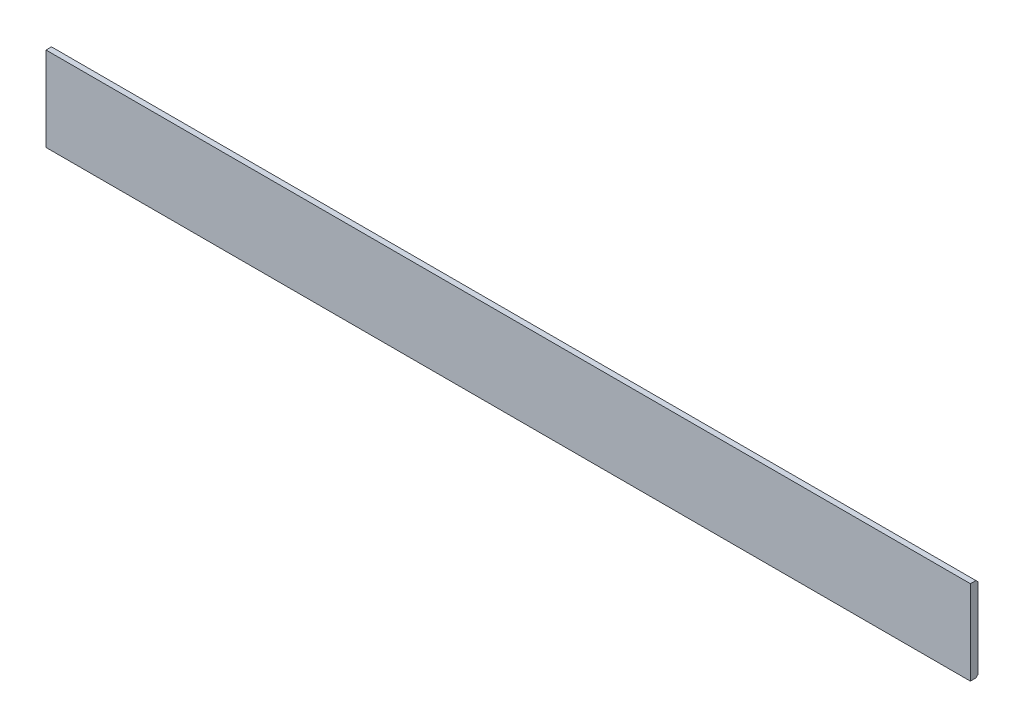
ISO-10303-21;
HEADER;
FILE_DESCRIPTION(('STEP AP214'),'2;1');
FILE_NAME('part.step','',(''),(''),'','','');
FILE_SCHEMA(('AUTOMOTIVE_DESIGN { 1 0 10303 214 1 1 1 1 }'));
ENDSEC;
DATA;
#1=APPLICATION_CONTEXT('core data for automotive mechanical design processes');
#2=APPLICATION_PROTOCOL_DEFINITION('international standard','automotive_design',2000,#1);
#3=PRODUCT_CONTEXT('',#1,'mechanical');
#4=PRODUCT('Part','Part','',(#3));
#5=PRODUCT_RELATED_PRODUCT_CATEGORY('part','',(#4));
#6=PRODUCT_DEFINITION_FORMATION('','',#4);
#7=PRODUCT_DEFINITION_CONTEXT('part definition',#1,'design');
#8=PRODUCT_DEFINITION('design','',#6,#7);
#9=PRODUCT_DEFINITION_SHAPE('','',#8);
#10=(LENGTH_UNIT() NAMED_UNIT(*) SI_UNIT(.MILLI.,.METRE.));
#11=(NAMED_UNIT(*) PLANE_ANGLE_UNIT() SI_UNIT($,.RADIAN.));
#12=(NAMED_UNIT(*) SI_UNIT($,.STERADIAN.) SOLID_ANGLE_UNIT());
#13=UNCERTAINTY_MEASURE_WITH_UNIT(LENGTH_MEASURE(1.E-05),#10,'distance_accuracy_value','');
#14=(GEOMETRIC_REPRESENTATION_CONTEXT(3) GLOBAL_UNCERTAINTY_ASSIGNED_CONTEXT((#13)) GLOBAL_UNIT_ASSIGNED_CONTEXT((#10,
#11,#12)) REPRESENTATION_CONTEXT('',''));
#15=CARTESIAN_POINT('',(0.,0.,0.));
#16=DIRECTION('',(0.,0.,1.));
#17=DIRECTION('',(1.,0.,0.));
#18=AXIS2_PLACEMENT_3D('',#15,#16,#17);
#19=CARTESIAN_POINT('',(1095.,100.,-18.));
#20=DIRECTION('',(1.,0.,0.));
#21=DIRECTION('',(0.,0.,-1.));
#22=AXIS2_PLACEMENT_3D('',#19,#20,#21);
#23=PLANE('',#22);
#24=DIRECTION('',(0.,0.,1.));
#25=VECTOR('',#24,1.);
#26=CARTESIAN_POINT('',(1095.,-100.,-18.));
#27=LINE('',#26,#25);
#28=CARTESIAN_POINT('',(1095.,-100.,-12.9999999999997));
#29=VERTEX_POINT('',#28);
#30=CARTESIAN_POINT('',(1095.,-100.,0.));
#31=VERTEX_POINT('',#30);
#32=EDGE_CURVE('E124',#29,#31,#27,.T.);
#33=ORIENTED_EDGE('',*,*,#32,.F.);
#34=DIRECTION('',(0.,0.707106781186532,-0.707106781186563));
#35=VECTOR('',#34,1.);
#36=CARTESIAN_POINT('',(1095.,2.49999999999573,-115.5));
#37=LINE('',#36,#35);
#38=CARTESIAN_POINT('',(1095.,-94.9999999999999,-18.));
#39=VERTEX_POINT('',#38);
#40=EDGE_CURVE('E133',#29,#39,#37,.T.);
#41=ORIENTED_EDGE('',*,*,#40,.T.);
#42=DIRECTION('',(0.,1.,0.));
#43=VECTOR('',#42,1.);
#44=CARTESIAN_POINT('',(1095.,100.,-18.));
#45=LINE('',#44,#43);
#46=CARTESIAN_POINT('',(1095.,94.9999999999999,-18.));
#47=VERTEX_POINT('',#46);
#48=EDGE_CURVE('E123',#39,#47,#45,.T.);
#49=ORIENTED_EDGE('',*,*,#48,.T.);
#50=DIRECTION('',(0.,0.707106781186532,0.707106781186563));
#51=VECTOR('',#50,1.);
#52=CARTESIAN_POINT('',(1095.,97.4999999999998,-15.4999999999999));
#53=LINE('',#52,#51);
#54=CARTESIAN_POINT('',(1095.,100.,-12.9999999999997));
#55=VERTEX_POINT('',#54);
#56=EDGE_CURVE('E100',#47,#55,#53,.T.);
#57=ORIENTED_EDGE('',*,*,#56,.T.);
#58=DIRECTION('',(0.,0.,1.));
#59=VECTOR('',#58,1.);
#60=CARTESIAN_POINT('',(1095.,100.,-18.));
#61=LINE('',#60,#59);
#62=CARTESIAN_POINT('',(1095.,100.,0.));
#63=VERTEX_POINT('',#62);
#64=EDGE_CURVE('E92',#55,#63,#61,.T.);
#65=ORIENTED_EDGE('',*,*,#64,.T.);
#66=DIRECTION('',(0.,1.,0.));
#67=VECTOR('',#66,1.);
#68=CARTESIAN_POINT('',(1095.,100.,0.));
#69=LINE('',#68,#67);
#70=EDGE_CURVE('E96',#31,#63,#69,.T.);
#71=ORIENTED_EDGE('',*,*,#70,.F.);
#72=EDGE_LOOP('',(#33,#41,#49,#57,#65,#71));
#73=FACE_BOUND('',#72,.T.);
#74=ADVANCED_FACE('F37',(#73),#23,.T.);
#75=CARTESIAN_POINT('',(-1095.,-100.,-18.));
#76=DIRECTION('',(0.,-1.,0.));
#77=DIRECTION('',(0.,0.,-1.));
#78=AXIS2_PLACEMENT_3D('',#75,#76,#77);
#79=PLANE('',#78);
#80=DIRECTION('',(0.,0.,1.));
#81=VECTOR('',#80,1.);
#82=CARTESIAN_POINT('',(-1095.,-100.,-18.));
#83=LINE('',#82,#81);
#84=CARTESIAN_POINT('',(-1095.,-100.,-12.9999999999997));
#85=VERTEX_POINT('',#84);
#86=CARTESIAN_POINT('',(-1095.,-100.,0.));
#87=VERTEX_POINT('',#86);
#88=EDGE_CURVE('E127',#85,#87,#83,.T.);
#89=ORIENTED_EDGE('',*,*,#88,.F.);
#90=DIRECTION('',(1.,0.,0.));
#91=VECTOR('',#90,1.);
#92=CARTESIAN_POINT('',(1095.,-100.,-12.9999999999997));
#93=LINE('',#92,#91);
#94=EDGE_CURVE('E126',#85,#29,#93,.T.);
#95=ORIENTED_EDGE('',*,*,#94,.T.);
#96=ORIENTED_EDGE('',*,*,#32,.T.);
#97=DIRECTION('',(1.,0.,0.));
#98=VECTOR('',#97,1.);
#99=CARTESIAN_POINT('',(-1095.,-100.,0.));
#100=LINE('',#99,#98);
#101=EDGE_CURVE('E116',#87,#31,#100,.T.);
#102=ORIENTED_EDGE('',*,*,#101,.F.);
#103=EDGE_LOOP('',(#89,#95,#96,#102));
#104=FACE_BOUND('',#103,.T.);
#105=ADVANCED_FACE('F145',(#104),#79,.T.);
#106=CARTESIAN_POINT('',(-1095.,100.,-18.));
#107=DIRECTION('',(-1.,0.,0.));
#108=DIRECTION('',(0.,0.,1.));
#109=AXIS2_PLACEMENT_3D('',#106,#107,#108);
#110=PLANE('',#109);
#111=DIRECTION('',(0.,-1.,0.));
#112=VECTOR('',#111,1.);
#113=CARTESIAN_POINT('',(-1095.,100.,-18.));
#114=LINE('',#113,#112);
#115=CARTESIAN_POINT('',(-1095.,94.9999999999999,-18.));
#116=VERTEX_POINT('',#115);
#117=CARTESIAN_POINT('',(-1095.,-94.9999999999999,-18.));
#118=VERTEX_POINT('',#117);
#119=EDGE_CURVE('E103',#116,#118,#114,.T.);
#120=ORIENTED_EDGE('',*,*,#119,.T.);
#121=DIRECTION('',(0.,-0.707106781186532,0.707106781186563));
#122=VECTOR('',#121,1.);
#123=CARTESIAN_POINT('',(-1095.,2.49999999999573,-115.5));
#124=LINE('',#123,#122);
#125=EDGE_CURVE('E45',#118,#85,#124,.T.);
#126=ORIENTED_EDGE('',*,*,#125,.T.);
#127=ORIENTED_EDGE('',*,*,#88,.T.);
#128=DIRECTION('',(0.,-1.,0.));
#129=VECTOR('',#128,1.);
#130=CARTESIAN_POINT('',(-1095.,100.,0.));
#131=LINE('',#130,#129);
#132=CARTESIAN_POINT('',(-1095.,100.,0.));
#133=VERTEX_POINT('',#132);
#134=EDGE_CURVE('E112',#133,#87,#131,.T.);
#135=ORIENTED_EDGE('',*,*,#134,.F.);
#136=DIRECTION('',(0.,0.,1.));
#137=VECTOR('',#136,1.);
#138=CARTESIAN_POINT('',(-1095.,100.,-18.));
#139=LINE('',#138,#137);
#140=CARTESIAN_POINT('',(-1095.,100.,-12.9999999999997));
#141=VERTEX_POINT('',#140);
#142=EDGE_CURVE('E102',#141,#133,#139,.T.);
#143=ORIENTED_EDGE('',*,*,#142,.F.);
#144=DIRECTION('',(0.,-0.707106781186532,-0.707106781186563));
#145=VECTOR('',#144,1.);
#146=CARTESIAN_POINT('',(-1095.,97.4999999999998,-15.4999999999999));
#147=LINE('',#146,#145);
#148=EDGE_CURVE('E52',#141,#116,#147,.T.);
#149=ORIENTED_EDGE('',*,*,#148,.T.);
#150=EDGE_LOOP('',(#120,#126,#127,#135,#143,#149));
#151=FACE_BOUND('',#150,.T.);
#152=ADVANCED_FACE('F141',(#151),#110,.T.);
#153=CARTESIAN_POINT('',(-1095.,100.,-18.));
#154=DIRECTION('',(0.,1.,0.));
#155=DIRECTION('',(0.,0.,1.));
#156=AXIS2_PLACEMENT_3D('',#153,#154,#155);
#157=PLANE('',#156);
#158=ORIENTED_EDGE('',*,*,#64,.F.);
#159=DIRECTION('',(-1.,0.,0.));
#160=VECTOR('',#159,1.);
#161=CARTESIAN_POINT('',(-1095.,100.,-12.9999999999997));
#162=LINE('',#161,#160);
#163=EDGE_CURVE('E11',#55,#141,#162,.T.);
#164=ORIENTED_EDGE('',*,*,#163,.T.);
#165=ORIENTED_EDGE('',*,*,#142,.T.);
#166=DIRECTION('',(-1.,0.,0.));
#167=VECTOR('',#166,1.);
#168=CARTESIAN_POINT('',(-1095.,100.,0.));
#169=LINE('',#168,#167);
#170=EDGE_CURVE('E106',#63,#133,#169,.T.);
#171=ORIENTED_EDGE('',*,*,#170,.F.);
#172=EDGE_LOOP('',(#158,#164,#165,#171));
#173=FACE_BOUND('',#172,.T.);
#174=ADVANCED_FACE('F107',(#173),#157,.T.);
#175=CARTESIAN_POINT('',(0.,0.,-18.));
#176=DIRECTION('',(0.,0.,1.));
#177=DIRECTION('',(1.,0.,0.));
#178=AXIS2_PLACEMENT_3D('',#175,#176,#177);
#179=PLANE('',#178);
#180=ORIENTED_EDGE('',*,*,#48,.F.);
#181=DIRECTION('',(-1.,0.,0.));
#182=VECTOR('',#181,1.);
#183=CARTESIAN_POINT('',(-1095.,-94.9999999999999,-18.));
#184=LINE('',#183,#182);
#185=EDGE_CURVE('E59',#39,#118,#184,.T.);
#186=ORIENTED_EDGE('',*,*,#185,.T.);
#187=ORIENTED_EDGE('',*,*,#119,.F.);
#188=DIRECTION('',(1.,0.,0.));
#189=VECTOR('',#188,1.);
#190=CARTESIAN_POINT('',(1095.,94.9999999999999,-18.));
#191=LINE('',#190,#189);
#192=EDGE_CURVE('E135',#116,#47,#191,.T.);
#193=ORIENTED_EDGE('',*,*,#192,.T.);
#194=EDGE_LOOP('',(#180,#186,#187,#193));
#195=FACE_BOUND('',#194,.T.);
#196=ADVANCED_FACE('F147',(#195),#179,.F.);
#197=CARTESIAN_POINT('',(0.,0.,0.));
#198=DIRECTION('',(0.,0.,1.));
#199=DIRECTION('',(1.,0.,0.));
#200=AXIS2_PLACEMENT_3D('',#197,#198,#199);
#201=PLANE('',#200);
#202=ORIENTED_EDGE('',*,*,#70,.T.);
#203=ORIENTED_EDGE('',*,*,#170,.T.);
#204=ORIENTED_EDGE('',*,*,#134,.T.);
#205=ORIENTED_EDGE('',*,*,#101,.T.);
#206=EDGE_LOOP('',(#202,#203,#204,#205));
#207=FACE_BOUND('',#206,.T.);
#208=ADVANCED_FACE('F114',(#207),#201,.T.);
#209=CARTESIAN_POINT('',(-1095.,-100.,-12.9999999999997));
#210=DIRECTION('',(0.,-0.707106781186563,-0.707106781186532));
#211=DIRECTION('',(-1.,0.,0.));
#212=AXIS2_PLACEMENT_3D('',#209,#210,#211);
#213=PLANE('',#212);
#214=ORIENTED_EDGE('',*,*,#125,.F.);
#215=ORIENTED_EDGE('',*,*,#185,.F.);
#216=ORIENTED_EDGE('',*,*,#40,.F.);
#217=ORIENTED_EDGE('',*,*,#94,.F.);
#218=EDGE_LOOP('',(#214,#215,#216,#217));
#219=FACE_BOUND('',#218,.T.);
#220=ADVANCED_FACE('F146',(#219),#213,.T.);
#221=CARTESIAN_POINT('',(-1095.,100.,-12.9999999999997));
#222=DIRECTION('',(0.,0.707106781186563,-0.707106781186532));
#223=DIRECTION('',(1.,0.,0.));
#224=AXIS2_PLACEMENT_3D('',#221,#222,#223);
#225=PLANE('',#224);
#226=ORIENTED_EDGE('',*,*,#56,.F.);
#227=ORIENTED_EDGE('',*,*,#192,.F.);
#228=ORIENTED_EDGE('',*,*,#148,.F.);
#229=ORIENTED_EDGE('',*,*,#163,.F.);
#230=EDGE_LOOP('',(#226,#227,#228,#229));
#231=FACE_BOUND('',#230,.T.);
#232=ADVANCED_FACE('F39',(#231),#225,.T.);
#233=CLOSED_SHELL('',(#74,#105,#152,#174,#196,#208,#220,#232));
#234=MANIFOLD_SOLID_BREP('B2',#233);
#235=ADVANCED_BREP_SHAPE_REPRESENTATION('',(#18,#234),#14);
#236=SHAPE_DEFINITION_REPRESENTATION(#9,#235);
ENDSEC;
END-ISO-10303-21;
